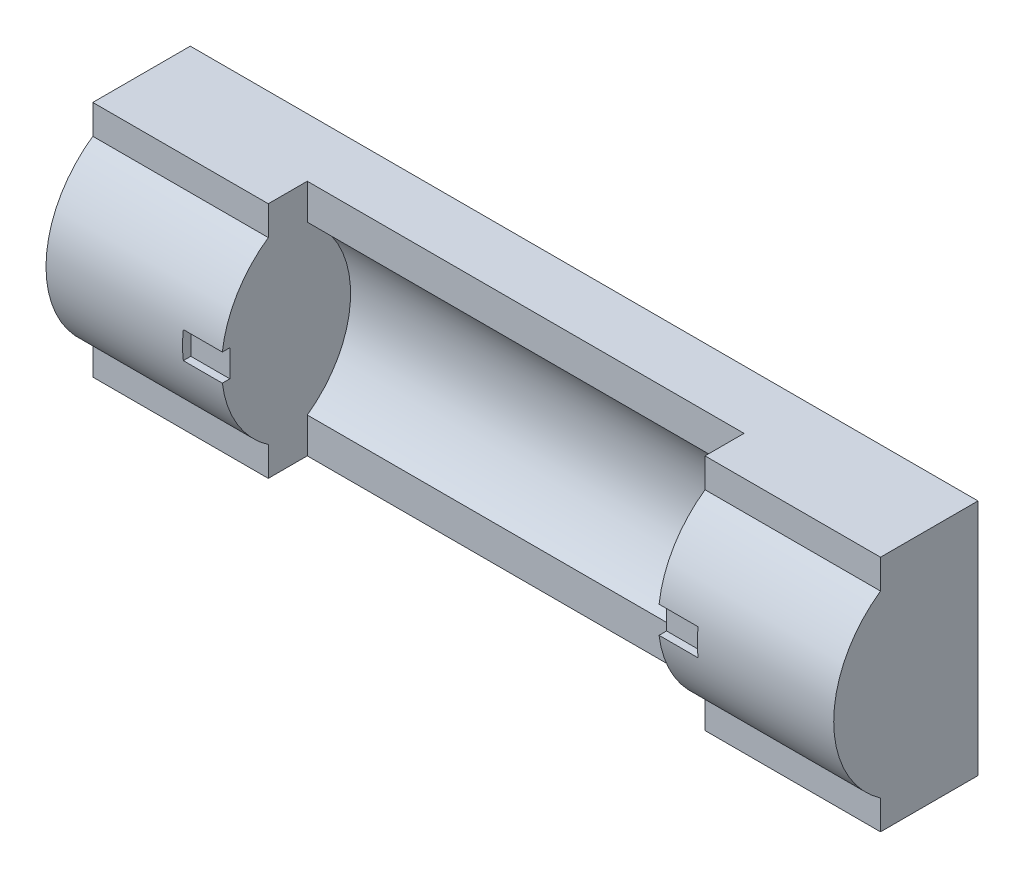
ISO-10303-21;
HEADER;
FILE_DESCRIPTION(('STEP AP214'),'2;1');
FILE_NAME('part.step','',(''),(''),'','','');
FILE_SCHEMA(('AUTOMOTIVE_DESIGN { 1 0 10303 214 1 1 1 1 }'));
ENDSEC;
DATA;
#1=APPLICATION_CONTEXT('core data for automotive mechanical design processes');
#2=APPLICATION_PROTOCOL_DEFINITION('international standard','automotive_design',2000,#1);
#3=PRODUCT_CONTEXT('',#1,'mechanical');
#4=PRODUCT('Part','Part','',(#3));
#5=PRODUCT_RELATED_PRODUCT_CATEGORY('part','',(#4));
#6=PRODUCT_DEFINITION_FORMATION('','',#4);
#7=PRODUCT_DEFINITION_CONTEXT('part definition',#1,'design');
#8=PRODUCT_DEFINITION('design','',#6,#7);
#9=PRODUCT_DEFINITION_SHAPE('','',#8);
#10=(LENGTH_UNIT() NAMED_UNIT(*) SI_UNIT(.MILLI.,.METRE.));
#11=(NAMED_UNIT(*) PLANE_ANGLE_UNIT() SI_UNIT($,.RADIAN.));
#12=(NAMED_UNIT(*) SI_UNIT($,.STERADIAN.) SOLID_ANGLE_UNIT());
#13=UNCERTAINTY_MEASURE_WITH_UNIT(LENGTH_MEASURE(1.E-05),#10,'distance_accuracy_value','');
#14=(GEOMETRIC_REPRESENTATION_CONTEXT(3) GLOBAL_UNCERTAINTY_ASSIGNED_CONTEXT((#13)) GLOBAL_UNIT_ASSIGNED_CONTEXT((#10,
#11,#12)) REPRESENTATION_CONTEXT('',''));
#15=CARTESIAN_POINT('',(0.,0.,0.));
#16=DIRECTION('',(0.,0.,1.));
#17=DIRECTION('',(1.,0.,0.));
#18=AXIS2_PLACEMENT_3D('',#15,#16,#17);
#19=CARTESIAN_POINT('',(0.,0.,175.220163865149));
#20=DIRECTION('',(0.,0.,1.));
#21=DIRECTION('',(1.,0.,0.));
#22=AXIS2_PLACEMENT_3D('',#19,#20,#21);
#23=PLANE('',#22);
#24=DIRECTION('',(0.,-1.,0.));
#25=VECTOR('',#24,1.);
#26=CARTESIAN_POINT('',(-51.334188953753,20.4268097449861,175.220163865149));
#27=LINE('',#26,#25);
#28=CARTESIAN_POINT('',(-51.334188953753,15.5503761870963,175.220163865149));
#29=VERTEX_POINT('',#28);
#30=CARTESIAN_POINT('',(-51.334188953753,14.6414389944274,175.220163865149));
#31=VERTEX_POINT('',#30);
#32=EDGE_CURVE('E359',#29,#31,#27,.T.);
#33=ORIENTED_EDGE('',*,*,#32,.F.);
#34=DIRECTION('',(1.,0.,0.));
#35=VECTOR('',#34,1.);
#36=CARTESIAN_POINT('',(-62.534188953753,15.5503761870963,175.220163865149));
#37=LINE('',#36,#35);
#38=CARTESIAN_POINT('',(-62.534188953753,15.5503761870963,175.220163865149));
#39=VERTEX_POINT('',#38);
#40=EDGE_CURVE('E192',#29,#39,#37,.F.);
#41=ORIENTED_EDGE('',*,*,#40,.T.);
#42=DIRECTION('',(0.,-1.,0.));
#43=VECTOR('',#42,1.);
#44=CARTESIAN_POINT('',(-62.534188953753,20.4268097449861,175.220163865149));
#45=LINE('',#44,#43);
#46=CARTESIAN_POINT('',(-62.534188953753,14.6414389944274,175.220163865149));
#47=VERTEX_POINT('',#46);
#48=EDGE_CURVE('E202',#39,#47,#45,.T.);
#49=ORIENTED_EDGE('',*,*,#48,.T.);
#50=DIRECTION('',(1.,0.,0.));
#51=VECTOR('',#50,1.);
#52=CARTESIAN_POINT('',(-67.034188953753,14.6414389944274,175.220163865149));
#53=LINE('',#52,#51);
#54=EDGE_CURVE('E221',#47,#31,#53,.T.);
#55=ORIENTED_EDGE('',*,*,#54,.T.);
#56=EDGE_LOOP('',(#33,#41,#49,#55));
#57=FACE_BOUND('',#56,.T.);
#58=ADVANCED_FACE('F35',(#57),#23,.T.);
#59=CARTESIAN_POINT('',(-62.534188953753,20.7414389944274,175.220163865149));
#60=VERTEX_POINT('',#59);
#61=CARTESIAN_POINT('',(-62.534188953753,19.8325018017585,175.220163865149));
#62=VERTEX_POINT('',#61);
#63=EDGE_CURVE('E199',#60,#62,#45,.T.);
#64=ORIENTED_EDGE('',*,*,#63,.T.);
#65=DIRECTION('',(1.,0.,0.));
#66=VECTOR('',#65,1.);
#67=CARTESIAN_POINT('',(-62.534188953753,19.8325018017585,175.220163865149));
#68=LINE('',#67,#66);
#69=CARTESIAN_POINT('',(-51.334188953753,19.8325018017585,175.220163865149));
#70=VERTEX_POINT('',#69);
#71=EDGE_CURVE('E185',#62,#70,#68,.T.);
#72=ORIENTED_EDGE('',*,*,#71,.T.);
#73=CARTESIAN_POINT('',(-51.334188953753,20.7414389944274,175.220163865149));
#74=VERTEX_POINT('',#73);
#75=EDGE_CURVE('E220',#74,#70,#27,.T.);
#76=ORIENTED_EDGE('',*,*,#75,.F.);
#77=DIRECTION('',(-1.,0.,0.));
#78=VECTOR('',#77,1.);
#79=CARTESIAN_POINT('',(-46.834188953753,20.7414389944274,175.220163865149));
#80=LINE('',#79,#78);
#81=EDGE_CURVE('E206',#74,#60,#80,.T.);
#82=ORIENTED_EDGE('',*,*,#81,.T.);
#83=EDGE_LOOP('',(#64,#72,#76,#82));
#84=FACE_BOUND('',#83,.T.);
#85=ADVANCED_FACE('F204',(#84),#23,.T.);
#86=CARTESIAN_POINT('',(-62.534188953753,17.6914389944274,174.619651787192));
#87=DIRECTION('',(-1.,0.,0.));
#88=DIRECTION('',(0.,0.,1.));
#89=AXIS2_PLACEMENT_3D('',#86,#87,#88);
#90=CYLINDRICAL_SURFACE('',#89,2.80051207795729);
#91=CARTESIAN_POINT('',(-62.534188953753,17.6914389944274,174.619651787192));
#92=DIRECTION('',(-1.,0.,0.));
#93=DIRECTION('',(0.,0.,1.));
#94=AXIS2_PLACEMENT_3D('',#91,#92,#93);
#95=CIRCLE('',#94,2.80051207795729);
#96=CARTESIAN_POINT('',(-62.534188953753,15.3933465273806,176.220163865149));
#97=VERTEX_POINT('',#96);
#98=CARTESIAN_POINT('',(-62.534188953753,17.3461556847211,177.39879685984));
#99=VERTEX_POINT('',#98);
#100=EDGE_CURVE('E212',#97,#99,#95,.T.);
#101=ORIENTED_EDGE('',*,*,#100,.T.);
#102=DIRECTION('',(-1.,0.,0.));
#103=VECTOR('',#102,1.);
#104=CARTESIAN_POINT('',(-62.534188953753,17.3461556847211,177.39879685984));
#105=LINE('',#104,#103);
#106=CARTESIAN_POINT('',(-63.534188953753,17.3461556847211,177.39879685984));
#107=VERTEX_POINT('',#106);
#108=EDGE_CURVE('E260',#99,#107,#105,.T.);
#109=ORIENTED_EDGE('',*,*,#108,.T.);
#110=CARTESIAN_POINT('',(-63.534188953753,17.6914389944274,174.619651787192));
#111=DIRECTION('',(1.,0.,0.));
#112=DIRECTION('',(0.,0.,-1.));
#113=AXIS2_PLACEMENT_3D('',#110,#111,#112);
#114=CIRCLE('',#113,2.80051207795729);
#115=CARTESIAN_POINT('',(-63.534188953753,18.0367223041338,177.39879685984));
#116=VERTEX_POINT('',#115);
#117=EDGE_CURVE('E11',#107,#116,#114,.F.);
#118=ORIENTED_EDGE('',*,*,#117,.T.);
#119=DIRECTION('',(-1.,0.,0.));
#120=VECTOR('',#119,1.);
#121=CARTESIAN_POINT('',(-62.534188953753,18.0367223041338,177.39879685984));
#122=LINE('',#121,#120);
#123=CARTESIAN_POINT('',(-62.534188953753,18.0367223041338,177.39879685984));
#124=VERTEX_POINT('',#123);
#125=EDGE_CURVE('E250',#116,#124,#122,.F.);
#126=ORIENTED_EDGE('',*,*,#125,.T.);
#127=CARTESIAN_POINT('',(-62.534188953753,19.9895314614743,176.220163865149));
#128=VERTEX_POINT('',#127);
#129=EDGE_CURVE('E219',#124,#128,#95,.T.);
#130=ORIENTED_EDGE('',*,*,#129,.T.);
#131=DIRECTION('',(-1.,0.,0.));
#132=VECTOR('',#131,1.);
#133=CARTESIAN_POINT('',(-62.534188953753,19.9895314614743,176.220163865149));
#134=LINE('',#133,#132);
#135=CARTESIAN_POINT('',(-67.034188953753,19.9895314614743,176.220163865149));
#136=VERTEX_POINT('',#135);
#137=EDGE_CURVE('E353',#136,#128,#134,.F.);
#138=ORIENTED_EDGE('',*,*,#137,.F.);
#139=CARTESIAN_POINT('',(-67.034188953753,17.6914389944274,174.619651787192));
#140=DIRECTION('',(-1.,0.,0.));
#141=DIRECTION('',(0.,0.,1.));
#142=AXIS2_PLACEMENT_3D('',#139,#140,#141);
#143=CIRCLE('',#142,2.80051207795729);
#144=CARTESIAN_POINT('',(-67.034188953753,15.3933465273806,176.220163865149));
#145=VERTEX_POINT('',#144);
#146=EDGE_CURVE('E216',#145,#136,#143,.T.);
#147=ORIENTED_EDGE('',*,*,#146,.F.);
#148=DIRECTION('',(-1.,0.,0.));
#149=VECTOR('',#148,1.);
#150=CARTESIAN_POINT('',(-62.534188953753,15.3933465273806,176.220163865149));
#151=LINE('',#150,#149);
#152=EDGE_CURVE('E269',#97,#145,#151,.T.);
#153=ORIENTED_EDGE('',*,*,#152,.F.);
#154=EDGE_LOOP('',(#101,#109,#118,#126,#130,#138,#147,#153));
#155=FACE_BOUND('',#154,.T.);
#156=ADVANCED_FACE('F256',(#155),#90,.T.);
#157=CARTESIAN_POINT('',(-62.534188953753,17.6914389944274,174.619651787192));
#158=DIRECTION('',(-1.,0.,0.));
#159=DIRECTION('',(0.,0.,1.));
#160=AXIS2_PLACEMENT_3D('',#157,#158,#159);
#161=PLANE('',#160);
#162=DIRECTION('',(0.,0.,-1.));
#163=VECTOR('',#162,1.);
#164=CARTESIAN_POINT('',(-62.534188953753,20.7414389944274,175.220163865149));
#165=LINE('',#164,#163);
#166=CARTESIAN_POINT('',(-62.534188953753,20.7414389944274,176.220163865149));
#167=VERTEX_POINT('',#166);
#168=EDGE_CURVE('E343',#167,#60,#165,.T.);
#169=ORIENTED_EDGE('',*,*,#168,.F.);
#170=DIRECTION('',(0.,1.,0.));
#171=VECTOR('',#170,1.);
#172=CARTESIAN_POINT('',(-62.534188953753,20.7414389944274,176.220163865149));
#173=LINE('',#172,#171);
#174=EDGE_CURVE('E264',#128,#167,#173,.T.);
#175=ORIENTED_EDGE('',*,*,#174,.F.);
#176=ORIENTED_EDGE('',*,*,#129,.F.);
#177=DIRECTION('',(0.,0.,1.));
#178=VECTOR('',#177,1.);
#179=CARTESIAN_POINT('',(-62.534188953753,18.0367223041338,174.619651787192));
#180=LINE('',#179,#178);
#181=CARTESIAN_POINT('',(-62.534188953753,18.0367223041338,177.206149070662));
#182=VERTEX_POINT('',#181);
#183=EDGE_CURVE('E43',#182,#124,#180,.T.);
#184=ORIENTED_EDGE('',*,*,#183,.F.);
#185=DIRECTION('',(0.,-1.,0.));
#186=VECTOR('',#185,1.);
#187=CARTESIAN_POINT('',(-62.534188953753,18.0367223041338,177.206149070662));
#188=LINE('',#187,#186);
#189=CARTESIAN_POINT('',(-62.534188953753,17.3461556847211,177.206149070662));
#190=VERTEX_POINT('',#189);
#191=EDGE_CURVE('E58',#182,#190,#188,.T.);
#192=ORIENTED_EDGE('',*,*,#191,.T.);
#193=DIRECTION('',(0.,0.,1.));
#194=VECTOR('',#193,1.);
#195=CARTESIAN_POINT('',(-62.534188953753,17.3461556847211,177.206149070662));
#196=LINE('',#195,#194);
#197=EDGE_CURVE('E274',#190,#99,#196,.T.);
#198=ORIENTED_EDGE('',*,*,#197,.T.);
#199=ORIENTED_EDGE('',*,*,#100,.F.);
#200=CARTESIAN_POINT('',(-62.534188953753,14.6414389944274,176.220163865149));
#201=VERTEX_POINT('',#200);
#202=EDGE_CURVE('E272',#201,#97,#173,.T.);
#203=ORIENTED_EDGE('',*,*,#202,.F.);
#204=DIRECTION('',(0.,0.,1.));
#205=VECTOR('',#204,1.);
#206=CARTESIAN_POINT('',(-62.534188953753,14.6414389944274,176.220163865149));
#207=LINE('',#206,#205);
#208=EDGE_CURVE('E339',#47,#201,#207,.T.);
#209=ORIENTED_EDGE('',*,*,#208,.F.);
#210=ORIENTED_EDGE('',*,*,#48,.F.);
#211=CARTESIAN_POINT('',(-62.534188953753,17.6914389944274,176.727148581343));
#212=DIRECTION('',(-1.,0.,0.));
#213=DIRECTION('',(0.,0.,1.));
#214=AXIS2_PLACEMENT_3D('',#211,#212,#213);
#215=CIRCLE('',#214,2.61823468768155);
#216=EDGE_CURVE('E188',#62,#39,#215,.T.);
#217=ORIENTED_EDGE('',*,*,#216,.F.);
#218=ORIENTED_EDGE('',*,*,#63,.F.);
#219=EDGE_LOOP('',(#169,#175,#176,#184,#192,#198,#199,#203,#209,#210,#217,#218));
#220=FACE_BOUND('',#219,.T.);
#221=ADVANCED_FACE('F198',(#220),#161,.F.);
#222=CARTESIAN_POINT('',(-67.034188953753,14.6414389944274,175.220163865149));
#223=DIRECTION('',(0.,1.,0.));
#224=DIRECTION('',(0.,0.,1.));
#225=AXIS2_PLACEMENT_3D('',#222,#223,#224);
#226=PLANE('',#225);
#227=DIRECTION('',(1.,0.,0.));
#228=VECTOR('',#227,1.);
#229=CARTESIAN_POINT('',(-67.034188953753,14.6414389944274,173.720163865149));
#230=LINE('',#229,#228);
#231=CARTESIAN_POINT('',(-67.034188953753,14.6414389944274,173.720163865149));
#232=VERTEX_POINT('',#231);
#233=CARTESIAN_POINT('',(-46.834188953753,14.6414389944274,173.720163865149));
#234=VERTEX_POINT('',#233);
#235=EDGE_CURVE('E207',#232,#234,#230,.T.);
#236=ORIENTED_EDGE('',*,*,#235,.T.);
#237=DIRECTION('',(0.,0.,-1.));
#238=VECTOR('',#237,1.);
#239=CARTESIAN_POINT('',(-46.834188953753,14.6414389944274,175.220163865149));
#240=LINE('',#239,#238);
#241=CARTESIAN_POINT('',(-46.834188953753,14.6414389944274,176.220163865149));
#242=VERTEX_POINT('',#241);
#243=EDGE_CURVE('E239',#242,#234,#240,.T.);
#244=ORIENTED_EDGE('',*,*,#243,.F.);
#245=DIRECTION('',(1.,0.,0.));
#246=VECTOR('',#245,1.);
#247=CARTESIAN_POINT('',(-51.334188953753,14.6414389944274,176.220163865149));
#248=LINE('',#247,#246);
#249=CARTESIAN_POINT('',(-51.334188953753,14.6414389944274,176.220163865149));
#250=VERTEX_POINT('',#249);
#251=EDGE_CURVE('E323',#250,#242,#248,.T.);
#252=ORIENTED_EDGE('',*,*,#251,.F.);
#253=DIRECTION('',(0.,0.,-1.));
#254=VECTOR('',#253,1.);
#255=CARTESIAN_POINT('',(-51.334188953753,14.6414389944274,176.220163865149));
#256=LINE('',#255,#254);
#257=EDGE_CURVE('E316',#250,#31,#256,.T.);
#258=ORIENTED_EDGE('',*,*,#257,.T.);
#259=ORIENTED_EDGE('',*,*,#54,.F.);
#260=ORIENTED_EDGE('',*,*,#208,.T.);
#261=DIRECTION('',(-1.,0.,0.));
#262=VECTOR('',#261,1.);
#263=CARTESIAN_POINT('',(-62.534188953753,14.6414389944274,176.220163865149));
#264=LINE('',#263,#262);
#265=CARTESIAN_POINT('',(-67.034188953753,14.6414389944274,176.220163865149));
#266=VERTEX_POINT('',#265);
#267=EDGE_CURVE('E345',#201,#266,#264,.T.);
#268=ORIENTED_EDGE('',*,*,#267,.T.);
#269=DIRECTION('',(0.,0.,-1.));
#270=VECTOR('',#269,1.);
#271=CARTESIAN_POINT('',(-67.034188953753,14.6414389944274,175.220163865149));
#272=LINE('',#271,#270);
#273=EDGE_CURVE('E225',#266,#232,#272,.T.);
#274=ORIENTED_EDGE('',*,*,#273,.T.);
#275=EDGE_LOOP('',(#236,#244,#252,#258,#259,#260,#268,#274));
#276=FACE_BOUND('',#275,.T.);
#277=ADVANCED_FACE('F37',(#276),#226,.F.);
#278=CARTESIAN_POINT('',(-46.834188953753,14.6414389944274,175.220163865149));
#279=DIRECTION('',(-1.,0.,0.));
#280=DIRECTION('',(0.,0.,1.));
#281=AXIS2_PLACEMENT_3D('',#278,#279,#280);
#282=PLANE('',#281);
#283=DIRECTION('',(0.,0.,-1.));
#284=VECTOR('',#283,1.);
#285=CARTESIAN_POINT('',(-46.834188953753,20.7414389944274,175.220163865149));
#286=LINE('',#285,#284);
#287=CARTESIAN_POINT('',(-46.834188953753,20.7414389944274,176.220163865149));
#288=VERTEX_POINT('',#287);
#289=CARTESIAN_POINT('',(-46.834188953753,20.7414389944274,173.720163865149));
#290=VERTEX_POINT('',#289);
#291=EDGE_CURVE('E236',#288,#290,#286,.T.);
#292=ORIENTED_EDGE('',*,*,#291,.F.);
#293=DIRECTION('',(0.,-1.,0.));
#294=VECTOR('',#293,1.);
#295=CARTESIAN_POINT('',(-46.834188953753,20.7414389944274,176.220163865149));
#296=LINE('',#295,#294);
#297=CARTESIAN_POINT('',(-46.834188953753,19.9895314614743,176.220163865149));
#298=VERTEX_POINT('',#297);
#299=EDGE_CURVE('E324',#288,#298,#296,.T.);
#300=ORIENTED_EDGE('',*,*,#299,.T.);
#301=CARTESIAN_POINT('',(-46.834188953753,17.6914389944274,174.619651787192));
#302=DIRECTION('',(-1.,0.,0.));
#303=DIRECTION('',(0.,0.,1.));
#304=AXIS2_PLACEMENT_3D('',#301,#302,#303);
#305=CIRCLE('',#304,2.80051207795729);
#306=CARTESIAN_POINT('',(-46.834188953753,15.3933465273806,176.220163865149));
#307=VERTEX_POINT('',#306);
#308=EDGE_CURVE('E355',#307,#298,#305,.T.);
#309=ORIENTED_EDGE('',*,*,#308,.F.);
#310=EDGE_CURVE('E313',#307,#242,#296,.T.);
#311=ORIENTED_EDGE('',*,*,#310,.T.);
#312=ORIENTED_EDGE('',*,*,#243,.T.);
#313=DIRECTION('',(0.,1.,0.));
#314=VECTOR('',#313,1.);
#315=CARTESIAN_POINT('',(-46.834188953753,14.6414389944274,173.720163865149));
#316=LINE('',#315,#314);
#317=EDGE_CURVE('E210',#234,#290,#316,.T.);
#318=ORIENTED_EDGE('',*,*,#317,.T.);
#319=EDGE_LOOP('',(#292,#300,#309,#311,#312,#318));
#320=FACE_BOUND('',#319,.T.);
#321=ADVANCED_FACE('F374',(#320),#282,.F.);
#322=CARTESIAN_POINT('',(-46.834188953753,20.7414389944274,175.220163865149));
#323=DIRECTION('',(0.,-1.,0.));
#324=DIRECTION('',(0.,0.,-1.));
#325=AXIS2_PLACEMENT_3D('',#322,#323,#324);
#326=PLANE('',#325);
#327=DIRECTION('',(-1.,0.,0.));
#328=VECTOR('',#327,1.);
#329=CARTESIAN_POINT('',(-46.834188953753,20.7414389944274,173.720163865149));
#330=LINE('',#329,#328);
#331=CARTESIAN_POINT('',(-67.034188953753,20.7414389944274,173.720163865149));
#332=VERTEX_POINT('',#331);
#333=EDGE_CURVE('E228',#290,#332,#330,.T.);
#334=ORIENTED_EDGE('',*,*,#333,.T.);
#335=DIRECTION('',(0.,0.,-1.));
#336=VECTOR('',#335,1.);
#337=CARTESIAN_POINT('',(-67.034188953753,20.7414389944274,175.220163865149));
#338=LINE('',#337,#336);
#339=CARTESIAN_POINT('',(-67.034188953753,20.7414389944274,176.220163865149));
#340=VERTEX_POINT('',#339);
#341=EDGE_CURVE('E233',#340,#332,#338,.T.);
#342=ORIENTED_EDGE('',*,*,#341,.F.);
#343=DIRECTION('',(-1.,0.,0.));
#344=VECTOR('',#343,1.);
#345=CARTESIAN_POINT('',(-62.534188953753,20.7414389944274,176.220163865149));
#346=LINE('',#345,#344);
#347=EDGE_CURVE('E347',#167,#340,#346,.T.);
#348=ORIENTED_EDGE('',*,*,#347,.F.);
#349=ORIENTED_EDGE('',*,*,#168,.T.);
#350=ORIENTED_EDGE('',*,*,#81,.F.);
#351=DIRECTION('',(0.,0.,1.));
#352=VECTOR('',#351,1.);
#353=CARTESIAN_POINT('',(-51.334188953753,20.7414389944274,176.220163865149));
#354=LINE('',#353,#352);
#355=CARTESIAN_POINT('',(-51.334188953753,20.7414389944274,176.220163865149));
#356=VERTEX_POINT('',#355);
#357=EDGE_CURVE('E320',#74,#356,#354,.T.);
#358=ORIENTED_EDGE('',*,*,#357,.T.);
#359=DIRECTION('',(1.,0.,0.));
#360=VECTOR('',#359,1.);
#361=CARTESIAN_POINT('',(-51.334188953753,20.7414389944274,176.220163865149));
#362=LINE('',#361,#360);
#363=EDGE_CURVE('E327',#356,#288,#362,.T.);
#364=ORIENTED_EDGE('',*,*,#363,.T.);
#365=ORIENTED_EDGE('',*,*,#291,.T.);
#366=EDGE_LOOP('',(#334,#342,#348,#349,#350,#358,#364,#365));
#367=FACE_BOUND('',#366,.T.);
#368=ADVANCED_FACE('F378',(#367),#326,.F.);
#369=CARTESIAN_POINT('',(-67.034188953753,20.7414389944274,175.220163865149));
#370=DIRECTION('',(1.,0.,0.));
#371=DIRECTION('',(0.,0.,-1.));
#372=AXIS2_PLACEMENT_3D('',#369,#370,#371);
#373=PLANE('',#372);
#374=ORIENTED_EDGE('',*,*,#273,.F.);
#375=DIRECTION('',(0.,1.,0.));
#376=VECTOR('',#375,1.);
#377=CARTESIAN_POINT('',(-67.034188953753,20.7414389944274,176.220163865149));
#378=LINE('',#377,#376);
#379=EDGE_CURVE('E341',#266,#145,#378,.T.);
#380=ORIENTED_EDGE('',*,*,#379,.T.);
#381=ORIENTED_EDGE('',*,*,#146,.T.);
#382=EDGE_CURVE('E338',#136,#340,#378,.T.);
#383=ORIENTED_EDGE('',*,*,#382,.T.);
#384=ORIENTED_EDGE('',*,*,#341,.T.);
#385=DIRECTION('',(0.,-1.,0.));
#386=VECTOR('',#385,1.);
#387=CARTESIAN_POINT('',(-67.034188953753,20.7414389944274,173.720163865149));
#388=LINE('',#387,#386);
#389=EDGE_CURVE('E224',#332,#232,#388,.T.);
#390=ORIENTED_EDGE('',*,*,#389,.T.);
#391=EDGE_LOOP('',(#374,#380,#381,#383,#384,#390));
#392=FACE_BOUND('',#391,.T.);
#393=ADVANCED_FACE('F384',(#392),#373,.F.);
#394=CARTESIAN_POINT('',(0.,0.,173.720163865149));
#395=DIRECTION('',(0.,0.,1.));
#396=DIRECTION('',(1.,0.,0.));
#397=AXIS2_PLACEMENT_3D('',#394,#395,#396);
#398=PLANE('',#397);
#399=ORIENTED_EDGE('',*,*,#235,.F.);
#400=ORIENTED_EDGE('',*,*,#389,.F.);
#401=ORIENTED_EDGE('',*,*,#333,.F.);
#402=ORIENTED_EDGE('',*,*,#317,.F.);
#403=EDGE_LOOP('',(#399,#400,#401,#402));
#404=FACE_BOUND('',#403,.T.);
#405=ADVANCED_FACE('F425',(#404),#398,.F.);
#406=CARTESIAN_POINT('',(-51.334188953753,17.6914389944274,174.619651787192));
#407=DIRECTION('',(1.,0.,0.));
#408=DIRECTION('',(0.,0.,-1.));
#409=AXIS2_PLACEMENT_3D('',#406,#407,#408);
#410=CYLINDRICAL_SURFACE('',#409,2.80051207795729);
#411=CARTESIAN_POINT('',(-51.334188953753,17.6914389944274,174.619651787192));
#412=DIRECTION('',(-1.,0.,0.));
#413=DIRECTION('',(0.,0.,1.));
#414=AXIS2_PLACEMENT_3D('',#411,#412,#413);
#415=CIRCLE('',#414,2.80051207795729);
#416=CARTESIAN_POINT('',(-51.334188953753,18.0367223041338,177.39879685984));
#417=VERTEX_POINT('',#416);
#418=CARTESIAN_POINT('',(-51.334188953753,19.9895314614743,176.220163865149));
#419=VERTEX_POINT('',#418);
#420=EDGE_CURVE('E360',#417,#419,#415,.T.);
#421=ORIENTED_EDGE('',*,*,#420,.F.);
#422=DIRECTION('',(1.,0.,0.));
#423=VECTOR('',#422,1.);
#424=CARTESIAN_POINT('',(-51.334188953753,18.0367223041338,177.39879685984));
#425=LINE('',#424,#423);
#426=CARTESIAN_POINT('',(-50.334188953753,18.0367223041338,177.39879685984));
#427=VERTEX_POINT('',#426);
#428=EDGE_CURVE('E310',#417,#427,#425,.T.);
#429=ORIENTED_EDGE('',*,*,#428,.T.);
#430=CARTESIAN_POINT('',(-50.334188953753,17.6914389944274,174.619651787192));
#431=DIRECTION('',(-1.,0.,0.));
#432=DIRECTION('',(0.,0.,1.));
#433=AXIS2_PLACEMENT_3D('',#430,#431,#432);
#434=CIRCLE('',#433,2.80051207795729);
#435=CARTESIAN_POINT('',(-50.334188953753,17.3461556847211,177.39879685984));
#436=VERTEX_POINT('',#435);
#437=EDGE_CURVE('E245',#436,#427,#434,.T.);
#438=ORIENTED_EDGE('',*,*,#437,.F.);
#439=DIRECTION('',(1.,0.,0.));
#440=VECTOR('',#439,1.);
#441=CARTESIAN_POINT('',(-51.334188953753,17.3461556847211,177.39879685984));
#442=LINE('',#441,#440);
#443=CARTESIAN_POINT('',(-51.334188953753,17.3461556847211,177.39879685984));
#444=VERTEX_POINT('',#443);
#445=EDGE_CURVE('E305',#436,#444,#442,.F.);
#446=ORIENTED_EDGE('',*,*,#445,.T.);
#447=CARTESIAN_POINT('',(-51.334188953753,15.3933465273806,176.220163865149));
#448=VERTEX_POINT('',#447);
#449=EDGE_CURVE('E356',#448,#444,#415,.T.);
#450=ORIENTED_EDGE('',*,*,#449,.F.);
#451=DIRECTION('',(1.,0.,0.));
#452=VECTOR('',#451,1.);
#453=CARTESIAN_POINT('',(-51.334188953753,15.3933465273806,176.220163865149));
#454=LINE('',#453,#452);
#455=EDGE_CURVE('E335',#448,#307,#454,.T.);
#456=ORIENTED_EDGE('',*,*,#455,.T.);
#457=ORIENTED_EDGE('',*,*,#308,.T.);
#458=DIRECTION('',(1.,0.,0.));
#459=VECTOR('',#458,1.);
#460=CARTESIAN_POINT('',(-51.334188953753,19.9895314614743,176.220163865149));
#461=LINE('',#460,#459);
#462=EDGE_CURVE('E330',#298,#419,#461,.F.);
#463=ORIENTED_EDGE('',*,*,#462,.T.);
#464=EDGE_LOOP('',(#421,#429,#438,#446,#450,#456,#457,#463));
#465=FACE_BOUND('',#464,.T.);
#466=ADVANCED_FACE('F369',(#465),#410,.T.);
#467=CARTESIAN_POINT('',(-51.334188953753,17.6914389944274,174.619651787192));
#468=DIRECTION('',(1.,0.,0.));
#469=DIRECTION('',(0.,0.,1.));
#470=AXIS2_PLACEMENT_3D('',#467,#468,#469);
#471=PLANE('',#470);
#472=ORIENTED_EDGE('',*,*,#75,.T.);
#473=CARTESIAN_POINT('',(-51.334188953753,17.6914389944274,176.727148581343));
#474=DIRECTION('',(-1.,0.,0.));
#475=DIRECTION('',(0.,0.,1.));
#476=AXIS2_PLACEMENT_3D('',#473,#474,#475);
#477=CIRCLE('',#476,2.61823468768155);
#478=EDGE_CURVE('E50',#70,#29,#477,.T.);
#479=ORIENTED_EDGE('',*,*,#478,.T.);
#480=ORIENTED_EDGE('',*,*,#32,.T.);
#481=ORIENTED_EDGE('',*,*,#257,.F.);
#482=DIRECTION('',(0.,-1.,0.));
#483=VECTOR('',#482,1.);
#484=CARTESIAN_POINT('',(-51.334188953753,20.7414389944274,176.220163865149));
#485=LINE('',#484,#483);
#486=EDGE_CURVE('E317',#448,#250,#485,.T.);
#487=ORIENTED_EDGE('',*,*,#486,.F.);
#488=ORIENTED_EDGE('',*,*,#449,.T.);
#489=DIRECTION('',(0.,0.,1.));
#490=VECTOR('',#489,1.);
#491=CARTESIAN_POINT('',(-51.334188953753,17.3461556847211,177.206149070662));
#492=LINE('',#491,#490);
#493=CARTESIAN_POINT('',(-51.334188953753,17.3461556847211,177.206149070662));
#494=VERTEX_POINT('',#493);
#495=EDGE_CURVE('E294',#494,#444,#492,.T.);
#496=ORIENTED_EDGE('',*,*,#495,.F.);
#497=DIRECTION('',(0.,-1.,0.));
#498=VECTOR('',#497,1.);
#499=CARTESIAN_POINT('',(-51.334188953753,18.0367223041338,177.206149070662));
#500=LINE('',#499,#498);
#501=CARTESIAN_POINT('',(-51.334188953753,18.0367223041338,177.206149070662));
#502=VERTEX_POINT('',#501);
#503=EDGE_CURVE('E289',#502,#494,#500,.T.);
#504=ORIENTED_EDGE('',*,*,#503,.F.);
#505=DIRECTION('',(0.,0.,1.));
#506=VECTOR('',#505,1.);
#507=CARTESIAN_POINT('',(-51.334188953753,18.0367223041338,174.619651787192));
#508=LINE('',#507,#506);
#509=EDGE_CURVE('E242',#502,#417,#508,.T.);
#510=ORIENTED_EDGE('',*,*,#509,.T.);
#511=ORIENTED_EDGE('',*,*,#420,.T.);
#512=EDGE_CURVE('E314',#356,#419,#485,.T.);
#513=ORIENTED_EDGE('',*,*,#512,.F.);
#514=ORIENTED_EDGE('',*,*,#357,.F.);
#515=EDGE_LOOP('',(#472,#479,#480,#481,#487,#488,#496,#504,#510,#511,#513,#514));
#516=FACE_BOUND('',#515,.T.);
#517=ADVANCED_FACE('F366',(#516),#471,.F.);
#518=CARTESIAN_POINT('',(-62.534188953753,20.7414389944274,176.220163865149));
#519=DIRECTION('',(0.,0.,1.));
#520=DIRECTION('',(1.,0.,0.));
#521=AXIS2_PLACEMENT_3D('',#518,#519,#520);
#522=PLANE('',#521);
#523=ORIENTED_EDGE('',*,*,#382,.F.);
#524=ORIENTED_EDGE('',*,*,#137,.T.);
#525=ORIENTED_EDGE('',*,*,#174,.T.);
#526=ORIENTED_EDGE('',*,*,#347,.T.);
#527=EDGE_LOOP('',(#523,#524,#525,#526));
#528=FACE_BOUND('',#527,.T.);
#529=ADVANCED_FACE('F382',(#528),#522,.T.);
#530=ORIENTED_EDGE('',*,*,#202,.T.);
#531=ORIENTED_EDGE('',*,*,#152,.T.);
#532=ORIENTED_EDGE('',*,*,#379,.F.);
#533=ORIENTED_EDGE('',*,*,#267,.F.);
#534=EDGE_LOOP('',(#530,#531,#532,#533));
#535=FACE_BOUND('',#534,.T.);
#536=ADVANCED_FACE('F387',(#535),#522,.T.);
#537=CARTESIAN_POINT('',(-51.334188953753,20.7414389944274,176.220163865149));
#538=DIRECTION('',(0.,0.,1.));
#539=DIRECTION('',(1.,0.,0.));
#540=AXIS2_PLACEMENT_3D('',#537,#538,#539);
#541=PLANE('',#540);
#542=ORIENTED_EDGE('',*,*,#455,.F.);
#543=ORIENTED_EDGE('',*,*,#486,.T.);
#544=ORIENTED_EDGE('',*,*,#251,.T.);
#545=ORIENTED_EDGE('',*,*,#310,.F.);
#546=EDGE_LOOP('',(#542,#543,#544,#545));
#547=FACE_BOUND('',#546,.T.);
#548=ADVANCED_FACE('F449',(#547),#541,.T.);
#549=ORIENTED_EDGE('',*,*,#462,.F.);
#550=ORIENTED_EDGE('',*,*,#299,.F.);
#551=ORIENTED_EDGE('',*,*,#363,.F.);
#552=ORIENTED_EDGE('',*,*,#512,.T.);
#553=EDGE_LOOP('',(#549,#550,#551,#552));
#554=FACE_BOUND('',#553,.T.);
#555=ADVANCED_FACE('F372',(#554),#541,.T.);
#556=CARTESIAN_POINT('',(-50.334188953753,0.,0.));
#557=DIRECTION('',(-1.,0.,0.));
#558=DIRECTION('',(0.,0.,1.));
#559=AXIS2_PLACEMENT_3D('',#556,#557,#558);
#560=PLANE('',#559);
#561=ORIENTED_EDGE('',*,*,#437,.T.);
#562=DIRECTION('',(0.,0.,-1.));
#563=VECTOR('',#562,1.);
#564=CARTESIAN_POINT('',(-50.334188953753,18.0367223041338,177.206149070662));
#565=LINE('',#564,#563);
#566=CARTESIAN_POINT('',(-50.334188953753,18.0367223041338,177.206149070662));
#567=VERTEX_POINT('',#566);
#568=EDGE_CURVE('E297',#427,#567,#565,.T.);
#569=ORIENTED_EDGE('',*,*,#568,.T.);
#570=DIRECTION('',(0.,-1.,0.));
#571=VECTOR('',#570,1.);
#572=CARTESIAN_POINT('',(-50.334188953753,18.0367223041338,177.206149070662));
#573=LINE('',#572,#571);
#574=CARTESIAN_POINT('',(-50.334188953753,17.3461556847211,177.206149070662));
#575=VERTEX_POINT('',#574);
#576=EDGE_CURVE('E290',#567,#575,#573,.T.);
#577=ORIENTED_EDGE('',*,*,#576,.T.);
#578=DIRECTION('',(0.,0.,1.));
#579=VECTOR('',#578,1.);
#580=CARTESIAN_POINT('',(-50.334188953753,17.3461556847211,177.206149070662));
#581=LINE('',#580,#579);
#582=EDGE_CURVE('E293',#575,#436,#581,.T.);
#583=ORIENTED_EDGE('',*,*,#582,.T.);
#584=EDGE_LOOP('',(#561,#569,#577,#583));
#585=FACE_BOUND('',#584,.T.);
#586=ADVANCED_FACE('F458',(#585),#560,.T.);
#587=CARTESIAN_POINT('',(-50.334188953753,18.0367223041338,177.206149070662));
#588=DIRECTION('',(0.,1.,0.));
#589=DIRECTION('',(0.,0.,1.));
#590=AXIS2_PLACEMENT_3D('',#587,#588,#589);
#591=PLANE('',#590);
#592=ORIENTED_EDGE('',*,*,#509,.F.);
#593=DIRECTION('',(-1.,0.,0.));
#594=VECTOR('',#593,1.);
#595=CARTESIAN_POINT('',(-50.334188953753,18.0367223041338,177.206149070662));
#596=LINE('',#595,#594);
#597=EDGE_CURVE('E302',#567,#502,#596,.T.);
#598=ORIENTED_EDGE('',*,*,#597,.F.);
#599=ORIENTED_EDGE('',*,*,#568,.F.);
#600=ORIENTED_EDGE('',*,*,#428,.F.);
#601=EDGE_LOOP('',(#592,#598,#599,#600));
#602=FACE_BOUND('',#601,.T.);
#603=ADVANCED_FACE('F455',(#602),#591,.F.);
#604=CARTESIAN_POINT('',(-50.334188953753,17.3461556847211,177.206149070662));
#605=DIRECTION('',(0.,-1.,0.));
#606=DIRECTION('',(0.,0.,-1.));
#607=AXIS2_PLACEMENT_3D('',#604,#605,#606);
#608=PLANE('',#607);
#609=ORIENTED_EDGE('',*,*,#582,.F.);
#610=DIRECTION('',(-1.,0.,0.));
#611=VECTOR('',#610,1.);
#612=CARTESIAN_POINT('',(-50.334188953753,17.3461556847211,177.206149070662));
#613=LINE('',#612,#611);
#614=EDGE_CURVE('E299',#575,#494,#613,.T.);
#615=ORIENTED_EDGE('',*,*,#614,.T.);
#616=ORIENTED_EDGE('',*,*,#495,.T.);
#617=ORIENTED_EDGE('',*,*,#445,.F.);
#618=EDGE_LOOP('',(#609,#615,#616,#617));
#619=FACE_BOUND('',#618,.T.);
#620=ADVANCED_FACE('F412',(#619),#608,.F.);
#621=CARTESIAN_POINT('',(-50.334188953753,18.0367223041338,177.206149070662));
#622=DIRECTION('',(0.,0.,-1.));
#623=DIRECTION('',(-1.,0.,0.));
#624=AXIS2_PLACEMENT_3D('',#621,#622,#623);
#625=PLANE('',#624);
#626=ORIENTED_EDGE('',*,*,#503,.T.);
#627=ORIENTED_EDGE('',*,*,#614,.F.);
#628=ORIENTED_EDGE('',*,*,#576,.F.);
#629=ORIENTED_EDGE('',*,*,#597,.T.);
#630=EDGE_LOOP('',(#626,#627,#628,#629));
#631=FACE_BOUND('',#630,.T.);
#632=ADVANCED_FACE('F405',(#631),#625,.F.);
#633=CARTESIAN_POINT('',(-63.534188953753,18.0367223041338,177.206149070662));
#634=DIRECTION('',(0.,0.,1.));
#635=DIRECTION('',(1.,0.,0.));
#636=AXIS2_PLACEMENT_3D('',#633,#634,#635);
#637=PLANE('',#636);
#638=ORIENTED_EDGE('',*,*,#191,.F.);
#639=DIRECTION('',(1.,0.,0.));
#640=VECTOR('',#639,1.);
#641=CARTESIAN_POINT('',(-63.534188953753,18.0367223041338,177.206149070662));
#642=LINE('',#641,#640);
#643=CARTESIAN_POINT('',(-63.534188953753,18.0367223041338,177.206149070662));
#644=VERTEX_POINT('',#643);
#645=EDGE_CURVE('E252',#644,#182,#642,.T.);
#646=ORIENTED_EDGE('',*,*,#645,.F.);
#647=DIRECTION('',(0.,-1.,0.));
#648=VECTOR('',#647,1.);
#649=CARTESIAN_POINT('',(-63.534188953753,18.0367223041338,177.206149070662));
#650=LINE('',#649,#648);
#651=CARTESIAN_POINT('',(-63.534188953753,17.3461556847211,177.206149070662));
#652=VERTEX_POINT('',#651);
#653=EDGE_CURVE('E277',#644,#652,#650,.T.);
#654=ORIENTED_EDGE('',*,*,#653,.T.);
#655=DIRECTION('',(1.,0.,0.));
#656=VECTOR('',#655,1.);
#657=CARTESIAN_POINT('',(-63.534188953753,17.3461556847211,177.206149070662));
#658=LINE('',#657,#656);
#659=EDGE_CURVE('E261',#652,#190,#658,.T.);
#660=ORIENTED_EDGE('',*,*,#659,.T.);
#661=EDGE_LOOP('',(#638,#646,#654,#660));
#662=FACE_BOUND('',#661,.T.);
#663=ADVANCED_FACE('F403',(#662),#637,.T.);
#664=CARTESIAN_POINT('',(-63.534188953753,17.3461556847211,177.206149070662));
#665=DIRECTION('',(0.,1.,0.));
#666=DIRECTION('',(0.,0.,1.));
#667=AXIS2_PLACEMENT_3D('',#664,#665,#666);
#668=PLANE('',#667);
#669=ORIENTED_EDGE('',*,*,#197,.F.);
#670=ORIENTED_EDGE('',*,*,#659,.F.);
#671=DIRECTION('',(0.,0.,1.));
#672=VECTOR('',#671,1.);
#673=CARTESIAN_POINT('',(-63.534188953753,17.3461556847211,177.206149070662));
#674=LINE('',#673,#672);
#675=EDGE_CURVE('E286',#652,#107,#674,.T.);
#676=ORIENTED_EDGE('',*,*,#675,.T.);
#677=ORIENTED_EDGE('',*,*,#108,.F.);
#678=EDGE_LOOP('',(#669,#670,#676,#677));
#679=FACE_BOUND('',#678,.T.);
#680=ADVANCED_FACE('F399',(#679),#668,.T.);
#681=CARTESIAN_POINT('',(-63.534188953753,18.0367223041338,177.206149070662));
#682=DIRECTION('',(0.,-1.,0.));
#683=DIRECTION('',(0.,0.,-1.));
#684=AXIS2_PLACEMENT_3D('',#681,#682,#683);
#685=PLANE('',#684);
#686=DIRECTION('',(0.,0.,-1.));
#687=VECTOR('',#686,1.);
#688=CARTESIAN_POINT('',(-63.534188953753,18.0367223041338,177.206149070662));
#689=LINE('',#688,#687);
#690=EDGE_CURVE('E280',#116,#644,#689,.T.);
#691=ORIENTED_EDGE('',*,*,#690,.T.);
#692=ORIENTED_EDGE('',*,*,#645,.T.);
#693=ORIENTED_EDGE('',*,*,#183,.T.);
#694=ORIENTED_EDGE('',*,*,#125,.F.);
#695=EDGE_LOOP('',(#691,#692,#693,#694));
#696=FACE_BOUND('',#695,.T.);
#697=ADVANCED_FACE('F249',(#696),#685,.T.);
#698=CARTESIAN_POINT('',(-63.534188953753,0.,0.));
#699=DIRECTION('',(1.,0.,0.));
#700=DIRECTION('',(0.,0.,1.));
#701=AXIS2_PLACEMENT_3D('',#698,#699,#700);
#702=PLANE('',#701);
#703=ORIENTED_EDGE('',*,*,#675,.F.);
#704=ORIENTED_EDGE('',*,*,#653,.F.);
#705=ORIENTED_EDGE('',*,*,#690,.F.);
#706=ORIENTED_EDGE('',*,*,#117,.F.);
#707=EDGE_LOOP('',(#703,#704,#705,#706));
#708=FACE_BOUND('',#707,.T.);
#709=ADVANCED_FACE('F402',(#708),#702,.T.);
#710=CARTESIAN_POINT('',(-62.534188953753,17.6914389944274,176.727148581343));
#711=DIRECTION('',(1.,0.,0.));
#712=DIRECTION('',(0.,0.,-1.));
#713=AXIS2_PLACEMENT_3D('',#710,#711,#712);
#714=CYLINDRICAL_SURFACE('',#713,2.61823468768155);
#715=ORIENTED_EDGE('',*,*,#478,.F.);
#716=ORIENTED_EDGE('',*,*,#71,.F.);
#717=ORIENTED_EDGE('',*,*,#216,.T.);
#718=ORIENTED_EDGE('',*,*,#40,.F.);
#719=EDGE_LOOP('',(#715,#716,#717,#718));
#720=FACE_BOUND('',#719,.T.);
#721=ADVANCED_FACE('F187',(#720),#714,.F.);
#722=CLOSED_SHELL('',(#58,#85,#156,#221,#277,#321,#368,#393,#405,#466,#517,#529,#536,#548,#555,
#586,#603,#620,#632,#663,#680,#697,#709,#721));
#723=MANIFOLD_SOLID_BREP('B2',#722);
#724=ADVANCED_BREP_SHAPE_REPRESENTATION('',(#18,#723),#14);
#725=SHAPE_DEFINITION_REPRESENTATION(#9,#724);
ENDSEC;
END-ISO-10303-21;
